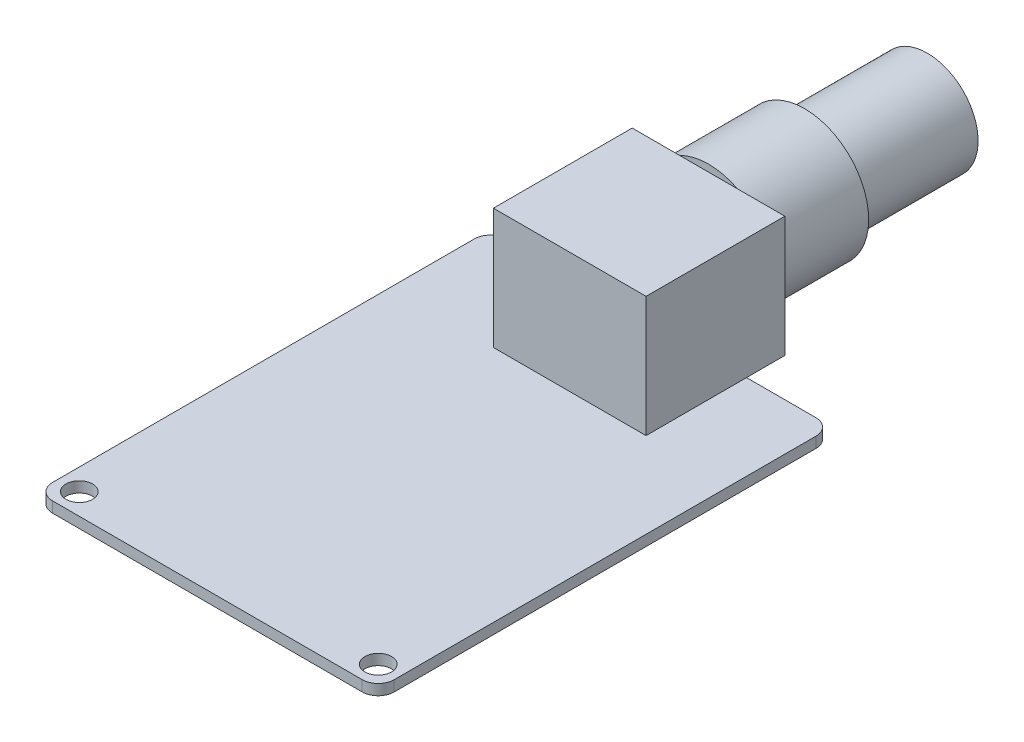
ISO-10303-21;
HEADER;
FILE_DESCRIPTION(('STEP AP214'),'2;1');
FILE_NAME('part.step','',(''),(''),'','','');
FILE_SCHEMA(('AUTOMOTIVE_DESIGN { 1 0 10303 214 1 1 1 1 }'));
ENDSEC;
DATA;
#1=APPLICATION_CONTEXT('core data for automotive mechanical design processes');
#2=APPLICATION_PROTOCOL_DEFINITION('international standard','automotive_design',2000,#1);
#3=PRODUCT_CONTEXT('',#1,'mechanical');
#4=PRODUCT('Part','Part','',(#3));
#5=PRODUCT_RELATED_PRODUCT_CATEGORY('part','',(#4));
#6=PRODUCT_DEFINITION_FORMATION('','',#4);
#7=PRODUCT_DEFINITION_CONTEXT('part definition',#1,'design');
#8=PRODUCT_DEFINITION('design','',#6,#7);
#9=PRODUCT_DEFINITION_SHAPE('','',#8);
#10=(LENGTH_UNIT() NAMED_UNIT(*) SI_UNIT(.MILLI.,.METRE.));
#11=(NAMED_UNIT(*) PLANE_ANGLE_UNIT() SI_UNIT($,.RADIAN.));
#12=(NAMED_UNIT(*) SI_UNIT($,.STERADIAN.) SOLID_ANGLE_UNIT());
#13=UNCERTAINTY_MEASURE_WITH_UNIT(LENGTH_MEASURE(1.E-05),#10,'distance_accuracy_value','');
#14=(GEOMETRIC_REPRESENTATION_CONTEXT(3) GLOBAL_UNCERTAINTY_ASSIGNED_CONTEXT((#13)) GLOBAL_UNIT_ASSIGNED_CONTEXT((#10,
#11,#12)) REPRESENTATION_CONTEXT('',''));
#15=CARTESIAN_POINT('',(0.,0.,0.));
#16=DIRECTION('',(0.,0.,1.));
#17=DIRECTION('',(1.,0.,0.));
#18=AXIS2_PLACEMENT_3D('',#15,#16,#17);
#19=CARTESIAN_POINT('',(-71.4909090909091,25.55,16.5));
#20=DIRECTION('',(0.,1.,0.));
#21=DIRECTION('',(0.,0.,1.));
#22=AXIS2_PLACEMENT_3D('',#19,#20,#21);
#23=PLANE('',#22);
#24=DIRECTION('',(1.,0.,0.));
#25=VECTOR('',#24,1.);
#26=CARTESIAN_POINT('',(-50.6909090909091,25.55,7.08792056437034));
#27=LINE('',#26,#25);
#28=CARTESIAN_POINT('',(-71.4909090909091,25.55,7.08792056437033));
#29=VERTEX_POINT('',#28);
#30=CARTESIAN_POINT('',(-57.1909090909091,25.55,7.08792056437033));
#31=VERTEX_POINT('',#30);
#32=EDGE_CURVE('E233',#29,#31,#27,.T.);
#33=ORIENTED_EDGE('',*,*,#32,.F.);
#34=DIRECTION('',(0.,0.,-1.));
#35=VECTOR('',#34,1.);
#36=CARTESIAN_POINT('',(-71.4909090909091,25.55,16.5));
#37=LINE('',#36,#35);
#38=CARTESIAN_POINT('',(-71.4909090909091,25.55,3.5));
#39=VERTEX_POINT('',#38);
#40=EDGE_CURVE('E207',#29,#39,#37,.T.);
#41=ORIENTED_EDGE('',*,*,#40,.T.);
#42=DIRECTION('',(1.,0.,0.));
#43=VECTOR('',#42,1.);
#44=CARTESIAN_POINT('',(-71.4909090909091,25.55,3.5));
#45=LINE('',#44,#43);
#46=CARTESIAN_POINT('',(-65.1138903325962,25.55,3.5));
#47=VERTEX_POINT('',#46);
#48=EDGE_CURVE('E190',#39,#47,#45,.T.);
#49=ORIENTED_EDGE('',*,*,#48,.T.);
#50=CARTESIAN_POINT('',(-63.567927849222,25.55,3.5));
#51=VERTEX_POINT('',#50);
#52=EDGE_CURVE('E48',#47,#51,#45,.T.);
#53=ORIENTED_EDGE('',*,*,#52,.T.);
#54=CARTESIAN_POINT('',(-57.1909090909091,25.55,3.5));
#55=VERTEX_POINT('',#54);
#56=EDGE_CURVE('E172',#51,#55,#45,.T.);
#57=ORIENTED_EDGE('',*,*,#56,.T.);
#58=DIRECTION('',(0.,0.,-1.));
#59=VECTOR('',#58,1.);
#60=CARTESIAN_POINT('',(-57.1909090909091,25.55,16.5));
#61=LINE('',#60,#59);
#62=EDGE_CURVE('E203',#31,#55,#61,.T.);
#63=ORIENTED_EDGE('',*,*,#62,.F.);
#64=EDGE_LOOP('',(#33,#41,#49,#53,#57,#63));
#65=FACE_BOUND('',#64,.T.);
#66=ADVANCED_FACE('F32',(#65),#23,.F.);
#67=CARTESIAN_POINT('',(-64.3409090909091,31.5,3.5));
#68=DIRECTION('',(0.,0.,1.));
#69=DIRECTION('',(1.,0.,0.));
#70=AXIS2_PLACEMENT_3D('',#67,#68,#69);
#71=PLANE('',#70);
#72=DIRECTION('',(-1.,0.,0.));
#73=VECTOR('',#72,1.);
#74=CARTESIAN_POINT('',(-71.4909090909091,36.85,3.5));
#75=LINE('',#74,#73);
#76=CARTESIAN_POINT('',(-61.6247537198009,36.85,3.5));
#77=VERTEX_POINT('',#76);
#78=CARTESIAN_POINT('',(-67.0570644620173,36.85,3.5));
#79=VERTEX_POINT('',#78);
#80=EDGE_CURVE('E41',#77,#79,#75,.T.);
#81=ORIENTED_EDGE('',*,*,#80,.F.);
#82=CARTESIAN_POINT('',(-64.3409090909091,31.5,3.5));
#83=DIRECTION('',(0.,0.,1.));
#84=DIRECTION('',(1.,0.,0.));
#85=AXIS2_PLACEMENT_3D('',#82,#83,#84);
#86=CIRCLE('',#85,6.);
#87=EDGE_CURVE('E36',#77,#79,#86,.T.);
#88=ORIENTED_EDGE('',*,*,#87,.T.);
#89=EDGE_LOOP('',(#81,#88));
#90=FACE_BOUND('',#89,.T.);
#91=ADVANCED_FACE('F242',(#90),#71,.T.);
#92=CARTESIAN_POINT('',(-64.3409090909091,31.5,3.5));
#93=DIRECTION('',(0.,0.,-1.));
#94=DIRECTION('',(-1.,0.,0.));
#95=AXIS2_PLACEMENT_3D('',#92,#93,#94);
#96=CYLINDRICAL_SURFACE('',#95,6.);
#97=ORIENTED_EDGE('',*,*,#87,.F.);
#98=EDGE_CURVE('E211',#51,#77,#86,.T.);
#99=ORIENTED_EDGE('',*,*,#98,.F.);
#100=EDGE_CURVE('E215',#47,#51,#86,.T.);
#101=ORIENTED_EDGE('',*,*,#100,.F.);
#102=EDGE_CURVE('E55',#79,#47,#86,.T.);
#103=ORIENTED_EDGE('',*,*,#102,.F.);
#104=EDGE_LOOP('',(#97,#99,#101,#103));
#105=FACE_BOUND('',#104,.T.);
#106=CARTESIAN_POINT('',(-64.3409090909091,31.5,-5.5));
#107=DIRECTION('',(0.,0.,1.));
#108=DIRECTION('',(1.,0.,0.));
#109=AXIS2_PLACEMENT_3D('',#106,#107,#108);
#110=CIRCLE('',#109,6.);
#111=CARTESIAN_POINT('',(-58.3409090909091,31.5,-5.5));
#112=VERTEX_POINT('',#111);
#113=EDGE_CURVE('E209',#112,#112,#110,.T.);
#114=ORIENTED_EDGE('',*,*,#113,.T.);
#115=EDGE_LOOP('',(#114));
#116=FACE_BOUND('',#115,.T.);
#117=ADVANCED_FACE('F34',(#105,#116),#96,.T.);
#118=ORIENTED_EDGE('',*,*,#52,.F.);
#119=ORIENTED_EDGE('',*,*,#100,.T.);
#120=EDGE_LOOP('',(#118,#119));
#121=FACE_BOUND('',#120,.T.);
#122=ADVANCED_FACE('F271',(#121),#71,.T.);
#123=CARTESIAN_POINT('',(-64.3409090909091,31.5,-5.5));
#124=DIRECTION('',(0.,0.,1.));
#125=DIRECTION('',(1.,0.,0.));
#126=AXIS2_PLACEMENT_3D('',#123,#124,#125);
#127=PLANE('',#126);
#128=CARTESIAN_POINT('',(-64.3409090909091,31.5,-5.5));
#129=DIRECTION('',(0.,0.,-1.));
#130=DIRECTION('',(-1.,0.,0.));
#131=AXIS2_PLACEMENT_3D('',#128,#129,#130);
#132=CIRCLE('',#131,4.75000000000001);
#133=CARTESIAN_POINT('',(-69.0909090909091,31.5,-5.5));
#134=VERTEX_POINT('',#133);
#135=EDGE_CURVE('E11',#134,#134,#132,.T.);
#136=ORIENTED_EDGE('',*,*,#135,.F.);
#137=EDGE_LOOP('',(#136));
#138=FACE_BOUND('',#137,.T.);
#139=ORIENTED_EDGE('',*,*,#113,.F.);
#140=EDGE_LOOP('',(#139));
#141=FACE_BOUND('',#140,.T.);
#142=ADVANCED_FACE('F276',(#138,#141),#127,.F.);
#143=CARTESIAN_POINT('',(0.,0.,3.5));
#144=DIRECTION('',(0.,0.,1.));
#145=DIRECTION('',(1.,0.,0.));
#146=AXIS2_PLACEMENT_3D('',#143,#144,#145);
#147=PLANE('',#146);
#148=CARTESIAN_POINT('',(-71.4909090909091,36.85,3.5));
#149=VERTEX_POINT('',#148);
#150=EDGE_CURVE('E195',#79,#149,#75,.T.);
#151=ORIENTED_EDGE('',*,*,#150,.F.);
#152=ORIENTED_EDGE('',*,*,#102,.T.);
#153=ORIENTED_EDGE('',*,*,#48,.F.);
#154=DIRECTION('',(0.,-1.,0.));
#155=VECTOR('',#154,1.);
#156=CARTESIAN_POINT('',(-71.4909090909091,36.85,3.5));
#157=LINE('',#156,#155);
#158=EDGE_CURVE('E169',#149,#39,#157,.T.);
#159=ORIENTED_EDGE('',*,*,#158,.F.);
#160=EDGE_LOOP('',(#151,#152,#153,#159));
#161=FACE_BOUND('',#160,.T.);
#162=ADVANCED_FACE('F224',(#161),#147,.F.);
#163=ORIENTED_EDGE('',*,*,#56,.F.);
#164=ORIENTED_EDGE('',*,*,#98,.T.);
#165=CARTESIAN_POINT('',(-57.1909090909091,36.85,3.5));
#166=VERTEX_POINT('',#165);
#167=EDGE_CURVE('E182',#166,#77,#75,.T.);
#168=ORIENTED_EDGE('',*,*,#167,.F.);
#169=DIRECTION('',(0.,1.,0.));
#170=VECTOR('',#169,1.);
#171=CARTESIAN_POINT('',(-57.1909090909091,36.85,3.5));
#172=LINE('',#171,#170);
#173=EDGE_CURVE('E193',#55,#166,#172,.T.);
#174=ORIENTED_EDGE('',*,*,#173,.F.);
#175=EDGE_LOOP('',(#163,#164,#168,#174));
#176=FACE_BOUND('',#175,.T.);
#177=ADVANCED_FACE('F244',(#176),#147,.F.);
#178=CARTESIAN_POINT('',(-71.4909090909091,36.85,16.5));
#179=DIRECTION('',(1.,0.,0.));
#180=DIRECTION('',(0.,0.,-1.));
#181=AXIS2_PLACEMENT_3D('',#178,#179,#180);
#182=PLANE('',#181);
#183=ORIENTED_EDGE('',*,*,#158,.T.);
#184=ORIENTED_EDGE('',*,*,#40,.F.);
#185=CARTESIAN_POINT('',(-71.4909090909091,25.55,16.5));
#186=VERTEX_POINT('',#185);
#187=EDGE_CURVE('E208',#186,#29,#37,.T.);
#188=ORIENTED_EDGE('',*,*,#187,.F.);
#189=DIRECTION('',(0.,-1.,0.));
#190=VECTOR('',#189,1.);
#191=CARTESIAN_POINT('',(-71.4909090909091,36.85,16.5));
#192=LINE('',#191,#190);
#193=CARTESIAN_POINT('',(-71.4909090909091,36.85,16.5));
#194=VERTEX_POINT('',#193);
#195=EDGE_CURVE('E178',#194,#186,#192,.T.);
#196=ORIENTED_EDGE('',*,*,#195,.F.);
#197=DIRECTION('',(0.,0.,-1.));
#198=VECTOR('',#197,1.);
#199=CARTESIAN_POINT('',(-71.4909090909091,36.85,16.5));
#200=LINE('',#199,#198);
#201=EDGE_CURVE('E188',#194,#149,#200,.T.);
#202=ORIENTED_EDGE('',*,*,#201,.T.);
#203=EDGE_LOOP('',(#183,#184,#188,#196,#202));
#204=FACE_BOUND('',#203,.T.);
#205=ADVANCED_FACE('F236',(#204),#182,.F.);
#206=CARTESIAN_POINT('',(-57.1909090909091,36.85,16.5));
#207=DIRECTION('',(-1.,0.,0.));
#208=DIRECTION('',(0.,0.,1.));
#209=AXIS2_PLACEMENT_3D('',#206,#207,#208);
#210=PLANE('',#209);
#211=ORIENTED_EDGE('',*,*,#173,.T.);
#212=DIRECTION('',(0.,0.,-1.));
#213=VECTOR('',#212,1.);
#214=CARTESIAN_POINT('',(-57.1909090909091,36.85,16.5));
#215=LINE('',#214,#213);
#216=CARTESIAN_POINT('',(-57.1909090909091,36.85,16.5));
#217=VERTEX_POINT('',#216);
#218=EDGE_CURVE('E200',#217,#166,#215,.T.);
#219=ORIENTED_EDGE('',*,*,#218,.F.);
#220=DIRECTION('',(0.,1.,0.));
#221=VECTOR('',#220,1.);
#222=CARTESIAN_POINT('',(-57.1909090909091,36.85,16.5));
#223=LINE('',#222,#221);
#224=CARTESIAN_POINT('',(-57.1909090909091,25.55,16.5));
#225=VERTEX_POINT('',#224);
#226=EDGE_CURVE('E185',#225,#217,#223,.T.);
#227=ORIENTED_EDGE('',*,*,#226,.F.);
#228=EDGE_CURVE('E204',#225,#31,#61,.T.);
#229=ORIENTED_EDGE('',*,*,#228,.T.);
#230=ORIENTED_EDGE('',*,*,#62,.T.);
#231=EDGE_LOOP('',(#211,#219,#227,#229,#230));
#232=FACE_BOUND('',#231,.T.);
#233=ADVANCED_FACE('F247',(#232),#210,.F.);
#234=CARTESIAN_POINT('',(-71.4909090909091,36.85,16.5));
#235=DIRECTION('',(0.,-1.,0.));
#236=DIRECTION('',(0.,0.,-1.));
#237=AXIS2_PLACEMENT_3D('',#234,#235,#236);
#238=PLANE('',#237);
#239=ORIENTED_EDGE('',*,*,#167,.T.);
#240=ORIENTED_EDGE('',*,*,#80,.T.);
#241=ORIENTED_EDGE('',*,*,#150,.T.);
#242=ORIENTED_EDGE('',*,*,#201,.F.);
#243=DIRECTION('',(-1.,0.,0.));
#244=VECTOR('',#243,1.);
#245=CARTESIAN_POINT('',(-71.4909090909091,36.85,16.5));
#246=LINE('',#245,#244);
#247=EDGE_CURVE('E187',#217,#194,#246,.T.);
#248=ORIENTED_EDGE('',*,*,#247,.F.);
#249=ORIENTED_EDGE('',*,*,#218,.T.);
#250=EDGE_LOOP('',(#239,#240,#241,#242,#248,#249));
#251=FACE_BOUND('',#250,.T.);
#252=ADVANCED_FACE('F241',(#251),#238,.F.);
#253=CARTESIAN_POINT('',(0.,0.,16.5));
#254=DIRECTION('',(0.,0.,1.));
#255=DIRECTION('',(1.,0.,0.));
#256=AXIS2_PLACEMENT_3D('',#253,#254,#255);
#257=PLANE('',#256);
#258=ORIENTED_EDGE('',*,*,#195,.T.);
#259=DIRECTION('',(1.,0.,0.));
#260=VECTOR('',#259,1.);
#261=CARTESIAN_POINT('',(-71.4909090909091,25.55,16.5));
#262=LINE('',#261,#260);
#263=EDGE_CURVE('E181',#186,#225,#262,.T.);
#264=ORIENTED_EDGE('',*,*,#263,.T.);
#265=ORIENTED_EDGE('',*,*,#226,.T.);
#266=ORIENTED_EDGE('',*,*,#247,.T.);
#267=EDGE_LOOP('',(#258,#264,#265,#266));
#268=FACE_BOUND('',#267,.T.);
#269=ADVANCED_FACE('F254',(#268),#257,.T.);
#270=CARTESIAN_POINT('',(-79.6909090909091,25.55,8.58792056437033));
#271=DIRECTION('',(0.,1.,0.));
#272=DIRECTION('',(0.,0.,1.));
#273=AXIS2_PLACEMENT_3D('',#270,#271,#272);
#274=PLANE('',#273);
#275=CARTESIAN_POINT('',(-79.1909090909091,25.55,47.5879205643703));
#276=DIRECTION('',(0.,-1.,0.));
#277=DIRECTION('',(0.,0.,-1.));
#278=AXIS2_PLACEMENT_3D('',#275,#276,#277);
#279=CIRCLE('',#278,1.25);
#280=CARTESIAN_POINT('',(-79.1909090909091,25.55,46.3379205643703));
#281=VERTEX_POINT('',#280);
#282=EDGE_CURVE('E490',#281,#281,#279,.T.);
#283=ORIENTED_EDGE('',*,*,#282,.T.);
#284=EDGE_LOOP('',(#283));
#285=FACE_BOUND('',#284,.T.);
#286=CARTESIAN_POINT('',(-51.1909090909091,25.55,47.5879205643703));
#287=DIRECTION('',(0.,-1.,0.));
#288=DIRECTION('',(0.,0.,-1.));
#289=AXIS2_PLACEMENT_3D('',#286,#287,#288);
#290=CIRCLE('',#289,1.25);
#291=CARTESIAN_POINT('',(-51.1909090909091,25.55,46.3379205643703));
#292=VERTEX_POINT('',#291);
#293=EDGE_CURVE('E498',#292,#292,#290,.T.);
#294=ORIENTED_EDGE('',*,*,#293,.T.);
#295=EDGE_LOOP('',(#294));
#296=FACE_BOUND('',#295,.T.);
#297=ORIENTED_EDGE('',*,*,#187,.T.);
#298=CARTESIAN_POINT('',(-79.6909090909091,25.55,7.08792056437033));
#299=VERTEX_POINT('',#298);
#300=EDGE_CURVE('E518',#299,#29,#27,.T.);
#301=ORIENTED_EDGE('',*,*,#300,.F.);
#302=CARTESIAN_POINT('',(-79.6909090909091,25.55,8.58792056437033));
#303=DIRECTION('',(0.,-1.,0.));
#304=DIRECTION('',(0.,0.,1.));
#305=AXIS2_PLACEMENT_3D('',#302,#303,#304);
#306=CIRCLE('',#305,1.5);
#307=CARTESIAN_POINT('',(-81.1909090909091,25.55,8.58792056437034));
#308=VERTEX_POINT('',#307);
#309=EDGE_CURVE('E168',#308,#299,#306,.T.);
#310=ORIENTED_EDGE('',*,*,#309,.F.);
#311=DIRECTION('',(0.,0.,-1.));
#312=VECTOR('',#311,1.);
#313=CARTESIAN_POINT('',(-81.1909090909091,25.55,8.58792056437034));
#314=LINE('',#313,#312);
#315=CARTESIAN_POINT('',(-81.1909090909091,25.55,48.0879205643703));
#316=VERTEX_POINT('',#315);
#317=EDGE_CURVE('E164',#316,#308,#314,.T.);
#318=ORIENTED_EDGE('',*,*,#317,.F.);
#319=CARTESIAN_POINT('',(-79.6909090909091,25.55,48.0879205643703));
#320=DIRECTION('',(0.,-1.,0.));
#321=DIRECTION('',(0.,0.,-1.));
#322=AXIS2_PLACEMENT_3D('',#319,#320,#321);
#323=CIRCLE('',#322,1.5);
#324=CARTESIAN_POINT('',(-79.6909090909091,25.55,49.5879205643703));
#325=VERTEX_POINT('',#324);
#326=EDGE_CURVE('E528',#325,#316,#323,.T.);
#327=ORIENTED_EDGE('',*,*,#326,.F.);
#328=DIRECTION('',(-1.,0.,0.));
#329=VECTOR('',#328,1.);
#330=CARTESIAN_POINT('',(-50.6909090909091,25.55,49.5879205643703));
#331=LINE('',#330,#329);
#332=CARTESIAN_POINT('',(-50.6909090909091,25.55,49.5879205643703));
#333=VERTEX_POINT('',#332);
#334=EDGE_CURVE('E526',#333,#325,#331,.T.);
#335=ORIENTED_EDGE('',*,*,#334,.F.);
#336=CARTESIAN_POINT('',(-50.6909090909091,25.55,48.0879205643703));
#337=DIRECTION('',(0.,-1.,0.));
#338=DIRECTION('',(0.,0.,-1.));
#339=AXIS2_PLACEMENT_3D('',#336,#337,#338);
#340=CIRCLE('',#339,1.5);
#341=CARTESIAN_POINT('',(-49.1909090909091,25.55,48.0879205643703));
#342=VERTEX_POINT('',#341);
#343=EDGE_CURVE('E524',#342,#333,#340,.T.);
#344=ORIENTED_EDGE('',*,*,#343,.F.);
#345=DIRECTION('',(0.,0.,1.));
#346=VECTOR('',#345,1.);
#347=CARTESIAN_POINT('',(-49.1909090909091,25.55,8.58792056437035));
#348=LINE('',#347,#346);
#349=CARTESIAN_POINT('',(-49.1909090909091,25.55,8.58792056437035));
#350=VERTEX_POINT('',#349);
#351=EDGE_CURVE('E522',#350,#342,#348,.T.);
#352=ORIENTED_EDGE('',*,*,#351,.F.);
#353=CARTESIAN_POINT('',(-50.6909090909091,25.55,8.58792056437034));
#354=DIRECTION('',(0.,-1.,0.));
#355=DIRECTION('',(0.,0.,-1.));
#356=AXIS2_PLACEMENT_3D('',#353,#354,#355);
#357=CIRCLE('',#356,1.5);
#358=CARTESIAN_POINT('',(-50.6909090909091,25.55,7.08792056437034));
#359=VERTEX_POINT('',#358);
#360=EDGE_CURVE('E520',#359,#350,#357,.T.);
#361=ORIENTED_EDGE('',*,*,#360,.F.);
#362=EDGE_CURVE('E252',#31,#359,#27,.T.);
#363=ORIENTED_EDGE('',*,*,#362,.F.);
#364=ORIENTED_EDGE('',*,*,#228,.F.);
#365=ORIENTED_EDGE('',*,*,#263,.F.);
#366=EDGE_LOOP('',(#297,#301,#310,#318,#327,#335,#344,#352,#361,#363,#364,#365));
#367=FACE_BOUND('',#366,.T.);
#368=ADVANCED_FACE('F250',(#285,#296,#367),#274,.T.);
#369=CARTESIAN_POINT('',(-79.6909090909091,24.55,8.58792056437033));
#370=DIRECTION('',(0.,1.,0.));
#371=DIRECTION('',(0.,0.,1.));
#372=AXIS2_PLACEMENT_3D('',#369,#370,#371);
#373=PLANE('',#372);
#374=CARTESIAN_POINT('',(-79.6909090909091,24.55,8.58792056437033));
#375=DIRECTION('',(0.,-1.,0.));
#376=DIRECTION('',(0.,0.,1.));
#377=AXIS2_PLACEMENT_3D('',#374,#375,#376);
#378=CIRCLE('',#377,1.5);
#379=CARTESIAN_POINT('',(-81.1909090909091,24.55,8.58792056437034));
#380=VERTEX_POINT('',#379);
#381=CARTESIAN_POINT('',(-79.6909090909091,24.55,7.08792056437033));
#382=VERTEX_POINT('',#381);
#383=EDGE_CURVE('E154',#380,#382,#378,.T.);
#384=ORIENTED_EDGE('',*,*,#383,.T.);
#385=DIRECTION('',(1.,0.,0.));
#386=VECTOR('',#385,1.);
#387=CARTESIAN_POINT('',(-50.6909090909091,24.55,7.08792056437034));
#388=LINE('',#387,#386);
#389=CARTESIAN_POINT('',(-50.6909090909091,24.55,7.08792056437034));
#390=VERTEX_POINT('',#389);
#391=EDGE_CURVE('E142',#382,#390,#388,.T.);
#392=ORIENTED_EDGE('',*,*,#391,.T.);
#393=CARTESIAN_POINT('',(-50.6909090909091,24.55,8.58792056437034));
#394=DIRECTION('',(0.,-1.,0.));
#395=DIRECTION('',(0.,0.,-1.));
#396=AXIS2_PLACEMENT_3D('',#393,#394,#395);
#397=CIRCLE('',#396,1.5);
#398=CARTESIAN_POINT('',(-49.1909090909091,24.55,8.58792056437035));
#399=VERTEX_POINT('',#398);
#400=EDGE_CURVE('E153',#390,#399,#397,.T.);
#401=ORIENTED_EDGE('',*,*,#400,.T.);
#402=DIRECTION('',(0.,0.,1.));
#403=VECTOR('',#402,1.);
#404=CARTESIAN_POINT('',(-49.1909090909091,24.55,8.58792056437035));
#405=LINE('',#404,#403);
#406=CARTESIAN_POINT('',(-49.1909090909091,24.55,48.0879205643703));
#407=VERTEX_POINT('',#406);
#408=EDGE_CURVE('E507',#399,#407,#405,.T.);
#409=ORIENTED_EDGE('',*,*,#408,.T.);
#410=CARTESIAN_POINT('',(-50.6909090909091,24.55,48.0879205643703));
#411=DIRECTION('',(0.,-1.,0.));
#412=DIRECTION('',(0.,0.,-1.));
#413=AXIS2_PLACEMENT_3D('',#410,#411,#412);
#414=CIRCLE('',#413,1.5);
#415=CARTESIAN_POINT('',(-50.6909090909091,24.55,49.5879205643703));
#416=VERTEX_POINT('',#415);
#417=EDGE_CURVE('E509',#407,#416,#414,.T.);
#418=ORIENTED_EDGE('',*,*,#417,.T.);
#419=DIRECTION('',(-1.,0.,0.));
#420=VECTOR('',#419,1.);
#421=CARTESIAN_POINT('',(-50.6909090909091,24.55,49.5879205643703));
#422=LINE('',#421,#420);
#423=CARTESIAN_POINT('',(-79.6909090909091,24.55,49.5879205643703));
#424=VERTEX_POINT('',#423);
#425=EDGE_CURVE('E511',#416,#424,#422,.T.);
#426=ORIENTED_EDGE('',*,*,#425,.T.);
#427=CARTESIAN_POINT('',(-79.6909090909091,24.55,48.0879205643703));
#428=DIRECTION('',(0.,-1.,0.));
#429=DIRECTION('',(0.,0.,-1.));
#430=AXIS2_PLACEMENT_3D('',#427,#428,#429);
#431=CIRCLE('',#430,1.5);
#432=CARTESIAN_POINT('',(-81.1909090909091,24.55,48.0879205643703));
#433=VERTEX_POINT('',#432);
#434=EDGE_CURVE('E513',#424,#433,#431,.T.);
#435=ORIENTED_EDGE('',*,*,#434,.T.);
#436=DIRECTION('',(0.,0.,-1.));
#437=VECTOR('',#436,1.);
#438=CARTESIAN_POINT('',(-81.1909090909091,24.55,8.58792056437034));
#439=LINE('',#438,#437);
#440=EDGE_CURVE('E160',#433,#380,#439,.T.);
#441=ORIENTED_EDGE('',*,*,#440,.T.);
#442=EDGE_LOOP('',(#384,#392,#401,#409,#418,#426,#435,#441));
#443=FACE_BOUND('',#442,.T.);
#444=CARTESIAN_POINT('',(-51.1909090909091,24.55,47.5879205643703));
#445=DIRECTION('',(0.,-1.,0.));
#446=DIRECTION('',(0.,0.,-1.));
#447=AXIS2_PLACEMENT_3D('',#444,#445,#446);
#448=CIRCLE('',#447,1.25);
#449=CARTESIAN_POINT('',(-51.1909090909091,24.55,46.3379205643703));
#450=VERTEX_POINT('',#449);
#451=EDGE_CURVE('E501',#450,#450,#448,.T.);
#452=ORIENTED_EDGE('',*,*,#451,.F.);
#453=EDGE_LOOP('',(#452));
#454=FACE_BOUND('',#453,.T.);
#455=CARTESIAN_POINT('',(-79.1909090909091,24.55,47.5879205643703));
#456=DIRECTION('',(0.,-1.,0.));
#457=DIRECTION('',(0.,0.,-1.));
#458=AXIS2_PLACEMENT_3D('',#455,#456,#457);
#459=CIRCLE('',#458,1.25);
#460=CARTESIAN_POINT('',(-79.1909090909091,24.55,46.3379205643703));
#461=VERTEX_POINT('',#460);
#462=EDGE_CURVE('E495',#461,#461,#459,.T.);
#463=ORIENTED_EDGE('',*,*,#462,.F.);
#464=EDGE_LOOP('',(#463));
#465=FACE_BOUND('',#464,.T.);
#466=ADVANCED_FACE('F157',(#443,#454,#465),#373,.F.);
#467=CARTESIAN_POINT('',(-79.6909090909091,24.55,8.58792056437033));
#468=DIRECTION('',(0.,1.,0.));
#469=DIRECTION('',(0.,0.,1.));
#470=AXIS2_PLACEMENT_3D('',#467,#468,#469);
#471=CYLINDRICAL_SURFACE('',#470,1.5);
#472=ORIENTED_EDGE('',*,*,#309,.T.);
#473=DIRECTION('',(0.,1.,0.));
#474=VECTOR('',#473,1.);
#475=CARTESIAN_POINT('',(-79.6909090909091,24.55,7.08792056437033));
#476=LINE('',#475,#474);
#477=EDGE_CURVE('E147',#382,#299,#476,.T.);
#478=ORIENTED_EDGE('',*,*,#477,.F.);
#479=ORIENTED_EDGE('',*,*,#383,.F.);
#480=DIRECTION('',(0.,1.,0.));
#481=VECTOR('',#480,1.);
#482=CARTESIAN_POINT('',(-81.1909090909091,24.55,8.58792056437034));
#483=LINE('',#482,#481);
#484=EDGE_CURVE('E516',#380,#308,#483,.T.);
#485=ORIENTED_EDGE('',*,*,#484,.T.);
#486=EDGE_LOOP('',(#472,#478,#479,#485));
#487=FACE_BOUND('',#486,.T.);
#488=ADVANCED_FACE('F166',(#487),#471,.T.);
#489=CARTESIAN_POINT('',(-50.6909090909091,24.55,7.08792056437034));
#490=DIRECTION('',(0.,0.,1.));
#491=DIRECTION('',(1.,0.,0.));
#492=AXIS2_PLACEMENT_3D('',#489,#490,#491);
#493=PLANE('',#492);
#494=ORIENTED_EDGE('',*,*,#300,.T.);
#495=ORIENTED_EDGE('',*,*,#32,.T.);
#496=ORIENTED_EDGE('',*,*,#362,.T.);
#497=DIRECTION('',(0.,1.,0.));
#498=VECTOR('',#497,1.);
#499=CARTESIAN_POINT('',(-50.6909090909091,24.55,7.08792056437034));
#500=LINE('',#499,#498);
#501=EDGE_CURVE('E150',#390,#359,#500,.T.);
#502=ORIENTED_EDGE('',*,*,#501,.F.);
#503=ORIENTED_EDGE('',*,*,#391,.F.);
#504=ORIENTED_EDGE('',*,*,#477,.T.);
#505=EDGE_LOOP('',(#494,#495,#496,#502,#503,#504));
#506=FACE_BOUND('',#505,.T.);
#507=ADVANCED_FACE('F145',(#506),#493,.F.);
#508=CARTESIAN_POINT('',(-50.6909090909091,24.55,8.58792056437034));
#509=DIRECTION('',(0.,1.,0.));
#510=DIRECTION('',(0.,0.,1.));
#511=AXIS2_PLACEMENT_3D('',#508,#509,#510);
#512=CYLINDRICAL_SURFACE('',#511,1.5);
#513=ORIENTED_EDGE('',*,*,#360,.T.);
#514=DIRECTION('',(0.,1.,0.));
#515=VECTOR('',#514,1.);
#516=CARTESIAN_POINT('',(-49.1909090909091,24.55,8.58792056437035));
#517=LINE('',#516,#515);
#518=EDGE_CURVE('E174',#399,#350,#517,.T.);
#519=ORIENTED_EDGE('',*,*,#518,.F.);
#520=ORIENTED_EDGE('',*,*,#400,.F.);
#521=ORIENTED_EDGE('',*,*,#501,.T.);
#522=EDGE_LOOP('',(#513,#519,#520,#521));
#523=FACE_BOUND('',#522,.T.);
#524=ADVANCED_FACE('F358',(#523),#512,.T.);
#525=CARTESIAN_POINT('',(-49.1909090909091,24.55,8.58792056437035));
#526=DIRECTION('',(-1.,0.,0.));
#527=DIRECTION('',(0.,0.,1.));
#528=AXIS2_PLACEMENT_3D('',#525,#526,#527);
#529=PLANE('',#528);
#530=ORIENTED_EDGE('',*,*,#351,.T.);
#531=DIRECTION('',(0.,1.,0.));
#532=VECTOR('',#531,1.);
#533=CARTESIAN_POINT('',(-49.1909090909091,24.55,48.0879205643703));
#534=LINE('',#533,#532);
#535=EDGE_CURVE('E541',#407,#342,#534,.T.);
#536=ORIENTED_EDGE('',*,*,#535,.F.);
#537=ORIENTED_EDGE('',*,*,#408,.F.);
#538=ORIENTED_EDGE('',*,*,#518,.T.);
#539=EDGE_LOOP('',(#530,#536,#537,#538));
#540=FACE_BOUND('',#539,.T.);
#541=ADVANCED_FACE('F366',(#540),#529,.F.);
#542=CARTESIAN_POINT('',(-50.6909090909091,24.55,48.0879205643703));
#543=DIRECTION('',(0.,1.,0.));
#544=DIRECTION('',(0.,0.,1.));
#545=AXIS2_PLACEMENT_3D('',#542,#543,#544);
#546=CYLINDRICAL_SURFACE('',#545,1.5);
#547=ORIENTED_EDGE('',*,*,#343,.T.);
#548=DIRECTION('',(0.,1.,0.));
#549=VECTOR('',#548,1.);
#550=CARTESIAN_POINT('',(-50.6909090909091,24.55,49.5879205643703));
#551=LINE('',#550,#549);
#552=EDGE_CURVE('E538',#416,#333,#551,.T.);
#553=ORIENTED_EDGE('',*,*,#552,.F.);
#554=ORIENTED_EDGE('',*,*,#417,.F.);
#555=ORIENTED_EDGE('',*,*,#535,.T.);
#556=EDGE_LOOP('',(#547,#553,#554,#555));
#557=FACE_BOUND('',#556,.T.);
#558=ADVANCED_FACE('F375',(#557),#546,.T.);
#559=CARTESIAN_POINT('',(-50.6909090909091,24.55,49.5879205643703));
#560=DIRECTION('',(0.,0.,-1.));
#561=DIRECTION('',(-1.,0.,0.));
#562=AXIS2_PLACEMENT_3D('',#559,#560,#561);
#563=PLANE('',#562);
#564=ORIENTED_EDGE('',*,*,#334,.T.);
#565=DIRECTION('',(0.,1.,0.));
#566=VECTOR('',#565,1.);
#567=CARTESIAN_POINT('',(-79.6909090909091,24.55,49.5879205643703));
#568=LINE('',#567,#566);
#569=EDGE_CURVE('E535',#424,#325,#568,.T.);
#570=ORIENTED_EDGE('',*,*,#569,.F.);
#571=ORIENTED_EDGE('',*,*,#425,.F.);
#572=ORIENTED_EDGE('',*,*,#552,.T.);
#573=EDGE_LOOP('',(#564,#570,#571,#572));
#574=FACE_BOUND('',#573,.T.);
#575=ADVANCED_FACE('F384',(#574),#563,.F.);
#576=CARTESIAN_POINT('',(-79.6909090909091,24.55,48.0879205643703));
#577=DIRECTION('',(0.,1.,0.));
#578=DIRECTION('',(0.,0.,1.));
#579=AXIS2_PLACEMENT_3D('',#576,#577,#578);
#580=CYLINDRICAL_SURFACE('',#579,1.5);
#581=ORIENTED_EDGE('',*,*,#326,.T.);
#582=DIRECTION('',(0.,1.,0.));
#583=VECTOR('',#582,1.);
#584=CARTESIAN_POINT('',(-81.1909090909091,24.55,48.0879205643703));
#585=LINE('',#584,#583);
#586=EDGE_CURVE('E532',#433,#316,#585,.T.);
#587=ORIENTED_EDGE('',*,*,#586,.F.);
#588=ORIENTED_EDGE('',*,*,#434,.F.);
#589=ORIENTED_EDGE('',*,*,#569,.T.);
#590=EDGE_LOOP('',(#581,#587,#588,#589));
#591=FACE_BOUND('',#590,.T.);
#592=ADVANCED_FACE('F393',(#591),#580,.T.);
#593=CARTESIAN_POINT('',(-81.1909090909091,24.55,8.58792056437034));
#594=DIRECTION('',(1.,0.,0.));
#595=DIRECTION('',(0.,0.,-1.));
#596=AXIS2_PLACEMENT_3D('',#593,#594,#595);
#597=PLANE('',#596);
#598=ORIENTED_EDGE('',*,*,#317,.T.);
#599=ORIENTED_EDGE('',*,*,#484,.F.);
#600=ORIENTED_EDGE('',*,*,#440,.F.);
#601=ORIENTED_EDGE('',*,*,#586,.T.);
#602=EDGE_LOOP('',(#598,#599,#600,#601));
#603=FACE_BOUND('',#602,.T.);
#604=ADVANCED_FACE('F402',(#603),#597,.F.);
#605=CARTESIAN_POINT('',(-51.1909090909091,24.55,47.5879205643703));
#606=DIRECTION('',(0.,1.,0.));
#607=DIRECTION('',(0.,0.,1.));
#608=AXIS2_PLACEMENT_3D('',#605,#606,#607);
#609=CYLINDRICAL_SURFACE('',#608,1.25);
#610=ORIENTED_EDGE('',*,*,#451,.T.);
#611=EDGE_LOOP('',(#610));
#612=FACE_BOUND('',#611,.T.);
#613=ORIENTED_EDGE('',*,*,#293,.F.);
#614=EDGE_LOOP('',(#613));
#615=FACE_BOUND('',#614,.T.);
#616=ADVANCED_FACE('F411',(#612,#615),#609,.F.);
#617=CARTESIAN_POINT('',(-79.1909090909091,24.55,47.5879205643703));
#618=DIRECTION('',(0.,1.,0.));
#619=DIRECTION('',(0.,0.,1.));
#620=AXIS2_PLACEMENT_3D('',#617,#618,#619);
#621=CYLINDRICAL_SURFACE('',#620,1.25);
#622=ORIENTED_EDGE('',*,*,#462,.T.);
#623=EDGE_LOOP('',(#622));
#624=FACE_BOUND('',#623,.T.);
#625=ORIENTED_EDGE('',*,*,#282,.F.);
#626=EDGE_LOOP('',(#625));
#627=FACE_BOUND('',#626,.T.);
#628=ADVANCED_FACE('F420',(#624,#627),#621,.F.);
#629=CARTESIAN_POINT('',(-64.3409090909091,31.5,-17.));
#630=DIRECTION('',(0.,0.,1.));
#631=DIRECTION('',(1.,0.,0.));
#632=AXIS2_PLACEMENT_3D('',#629,#630,#631);
#633=CYLINDRICAL_SURFACE('',#632,4.75000000000001);
#634=CARTESIAN_POINT('',(-64.3409090909091,31.5,-17.));
#635=DIRECTION('',(0.,0.,-1.));
#636=DIRECTION('',(-1.,0.,0.));
#637=AXIS2_PLACEMENT_3D('',#634,#635,#636);
#638=CIRCLE('',#637,4.75000000000001);
#639=CARTESIAN_POINT('',(-69.0909090909091,31.5,-17.));
#640=VERTEX_POINT('',#639);
#641=EDGE_CURVE('E486',#640,#640,#638,.T.);
#642=ORIENTED_EDGE('',*,*,#641,.F.);
#643=EDGE_LOOP('',(#642));
#644=FACE_BOUND('',#643,.T.);
#645=ORIENTED_EDGE('',*,*,#135,.T.);
#646=EDGE_LOOP('',(#645));
#647=FACE_BOUND('',#646,.T.);
#648=ADVANCED_FACE('F429',(#644,#647),#633,.T.);
#649=CARTESIAN_POINT('',(-64.3409090909091,31.5,-17.));
#650=DIRECTION('',(0.,0.,-1.));
#651=DIRECTION('',(-1.,0.,0.));
#652=AXIS2_PLACEMENT_3D('',#649,#650,#651);
#653=PLANE('',#652);
#654=CARTESIAN_POINT('',(-64.3409090909091,31.5,-17.));
#655=DIRECTION('',(0.,0.,-1.));
#656=DIRECTION('',(-1.,0.,0.));
#657=AXIS2_PLACEMENT_3D('',#654,#655,#656);
#658=CIRCLE('',#657,4.25000000000001);
#659=CARTESIAN_POINT('',(-68.5909090909091,31.5,-17.));
#660=VERTEX_POINT('',#659);
#661=EDGE_CURVE('E487',#660,#660,#658,.T.);
#662=ORIENTED_EDGE('',*,*,#661,.F.);
#663=EDGE_LOOP('',(#662));
#664=FACE_BOUND('',#663,.T.);
#665=ORIENTED_EDGE('',*,*,#641,.T.);
#666=EDGE_LOOP('',(#665));
#667=FACE_BOUND('',#666,.T.);
#668=ADVANCED_FACE('F438',(#664,#667),#653,.T.);
#669=CARTESIAN_POINT('',(-64.3409090909091,31.5,-5.5));
#670=DIRECTION('',(0.,0.,-1.));
#671=DIRECTION('',(-1.,0.,0.));
#672=AXIS2_PLACEMENT_3D('',#669,#670,#671);
#673=CYLINDRICAL_SURFACE('',#672,4.25000000000001);
#674=CARTESIAN_POINT('',(-64.3409090909091,31.5,-5.5));
#675=DIRECTION('',(0.,0.,-1.));
#676=DIRECTION('',(-1.,0.,0.));
#677=AXIS2_PLACEMENT_3D('',#674,#675,#676);
#678=CIRCLE('',#677,4.25000000000001);
#679=CARTESIAN_POINT('',(-68.5909090909091,31.5,-5.5));
#680=VERTEX_POINT('',#679);
#681=EDGE_CURVE('E485',#680,#680,#678,.T.);
#682=ORIENTED_EDGE('',*,*,#681,.F.);
#683=EDGE_LOOP('',(#682));
#684=FACE_BOUND('',#683,.T.);
#685=ORIENTED_EDGE('',*,*,#661,.T.);
#686=EDGE_LOOP('',(#685));
#687=FACE_BOUND('',#686,.T.);
#688=ADVANCED_FACE('F447',(#684,#687),#673,.F.);
#689=CARTESIAN_POINT('',(-64.3409090909091,31.5,-5.5));
#690=DIRECTION('',(0.,0.,-1.));
#691=DIRECTION('',(-1.,0.,0.));
#692=AXIS2_PLACEMENT_3D('',#689,#690,#691);
#693=PLANE('',#692);
#694=ORIENTED_EDGE('',*,*,#681,.T.);
#695=EDGE_LOOP('',(#694));
#696=FACE_BOUND('',#695,.T.);
#697=ADVANCED_FACE('F456',(#696),#693,.T.);
#698=CLOSED_SHELL('',(#66,#91,#117,#122,#142,#162,#177,#205,#233,#252,#269,#368,#466,#488,#507,
#524,#541,#558,#575,#592,#604,#616,#628,#648,#668,#688,#697));
#699=MANIFOLD_SOLID_BREP('B2',#698);
#700=ADVANCED_BREP_SHAPE_REPRESENTATION('',(#18,#699),#14);
#701=SHAPE_DEFINITION_REPRESENTATION(#9,#700);
ENDSEC;
END-ISO-10303-21;
